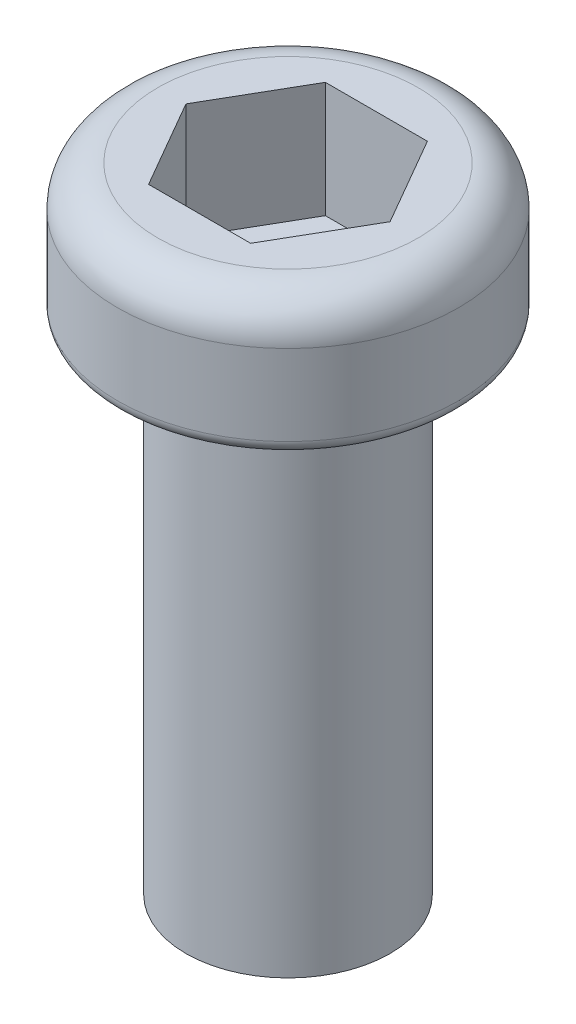
ISO-10303-21;
HEADER;
FILE_DESCRIPTION(('STEP AP214'),'2;1');
FILE_NAME('part.step','',(''),(''),'','','');
FILE_SCHEMA(('AUTOMOTIVE_DESIGN { 1 0 10303 214 1 1 1 1 }'));
ENDSEC;
DATA;
#1=APPLICATION_CONTEXT('core data for automotive mechanical design processes');
#2=APPLICATION_PROTOCOL_DEFINITION('international standard','automotive_design',2000,#1);
#3=PRODUCT_CONTEXT('',#1,'mechanical');
#4=PRODUCT('Part','Part','',(#3));
#5=PRODUCT_RELATED_PRODUCT_CATEGORY('part','',(#4));
#6=PRODUCT_DEFINITION_FORMATION('','',#4);
#7=PRODUCT_DEFINITION_CONTEXT('part definition',#1,'design');
#8=PRODUCT_DEFINITION('design','',#6,#7);
#9=PRODUCT_DEFINITION_SHAPE('','',#8);
#10=(LENGTH_UNIT() NAMED_UNIT(*) SI_UNIT(.MILLI.,.METRE.));
#11=(NAMED_UNIT(*) PLANE_ANGLE_UNIT() SI_UNIT($,.RADIAN.));
#12=(NAMED_UNIT(*) SI_UNIT($,.STERADIAN.) SOLID_ANGLE_UNIT());
#13=UNCERTAINTY_MEASURE_WITH_UNIT(LENGTH_MEASURE(1.E-05),#10,'distance_accuracy_value','');
#14=(GEOMETRIC_REPRESENTATION_CONTEXT(3) GLOBAL_UNCERTAINTY_ASSIGNED_CONTEXT((#13)) GLOBAL_UNIT_ASSIGNED_CONTEXT((#10,
#11,#12)) REPRESENTATION_CONTEXT('',''));
#15=CARTESIAN_POINT('',(0.,0.,0.));
#16=DIRECTION('',(0.,0.,1.));
#17=DIRECTION('',(1.,0.,0.));
#18=AXIS2_PLACEMENT_3D('',#15,#16,#17);
#19=CARTESIAN_POINT('',(0.,2.5,0.));
#20=DIRECTION('',(0.,-1.,0.));
#21=DIRECTION('',(0.,0.,-1.));
#22=AXIS2_PLACEMENT_3D('',#19,#20,#21);
#23=CYLINDRICAL_SURFACE('',#22,3.175);
#24=CARTESIAN_POINT('',(0.,0.25,0.));
#25=DIRECTION('',(0.,1.,0.));
#26=DIRECTION('',(0.,0.,1.));
#27=AXIS2_PLACEMENT_3D('',#24,#25,#26);
#28=CIRCLE('',#27,3.175);
#29=CARTESIAN_POINT('',(0.,0.25,3.175));
#30=VERTEX_POINT('',#29);
#31=EDGE_CURVE('E41',#30,#30,#28,.T.);
#32=ORIENTED_EDGE('',*,*,#31,.T.);
#33=EDGE_LOOP('',(#32));
#34=FACE_BOUND('',#33,.T.);
#35=CARTESIAN_POINT('',(0.,1.75,0.));
#36=DIRECTION('',(0.,1.,0.));
#37=DIRECTION('',(0.,0.,1.));
#38=AXIS2_PLACEMENT_3D('',#35,#36,#37);
#39=CIRCLE('',#38,3.175);
#40=CARTESIAN_POINT('',(0.,1.75,3.175));
#41=VERTEX_POINT('',#40);
#42=EDGE_CURVE('E144',#41,#41,#39,.F.);
#43=ORIENTED_EDGE('',*,*,#42,.T.);
#44=EDGE_LOOP('',(#43));
#45=FACE_BOUND('',#44,.T.);
#46=ADVANCED_FACE('F33',(#34,#45),#23,.T.);
#47=CARTESIAN_POINT('',(0.,2.5,0.));
#48=DIRECTION('',(0.,1.,0.));
#49=DIRECTION('',(0.,0.,1.));
#50=AXIS2_PLACEMENT_3D('',#47,#48,#49);
#51=PLANE('',#50);
#52=CARTESIAN_POINT('',(0.,2.5,0.));
#53=DIRECTION('',(0.,1.,0.));
#54=DIRECTION('',(0.,0.,1.));
#55=AXIS2_PLACEMENT_3D('',#52,#53,#54);
#56=CIRCLE('',#55,2.425);
#57=CARTESIAN_POINT('',(0.,2.5,2.425));
#58=VERTEX_POINT('',#57);
#59=EDGE_CURVE('E136',#58,#58,#56,.T.);
#60=ORIENTED_EDGE('',*,*,#59,.T.);
#61=EDGE_LOOP('',(#60));
#62=FACE_BOUND('',#61,.T.);
#63=DIRECTION('',(-0.5,0.,-0.866025403784438));
#64=VECTOR('',#63,1.);
#65=CARTESIAN_POINT('',(1.9,2.5,0.));
#66=LINE('',#65,#64);
#67=CARTESIAN_POINT('',(1.9,2.5,0.));
#68=VERTEX_POINT('',#67);
#69=CARTESIAN_POINT('',(0.95,2.5,-1.64544826719043));
#70=VERTEX_POINT('',#69);
#71=EDGE_CURVE('E48',#68,#70,#66,.T.);
#72=ORIENTED_EDGE('',*,*,#71,.F.);
#73=DIRECTION('',(0.5,0.,-0.866025403784439));
#74=VECTOR('',#73,1.);
#75=CARTESIAN_POINT('',(0.95,2.5,1.64544826719043));
#76=LINE('',#75,#74);
#77=CARTESIAN_POINT('',(0.95,2.5,1.64544826719043));
#78=VERTEX_POINT('',#77);
#79=EDGE_CURVE('E132',#78,#68,#76,.T.);
#80=ORIENTED_EDGE('',*,*,#79,.F.);
#81=DIRECTION('',(1.,0.,0.));
#82=VECTOR('',#81,1.);
#83=CARTESIAN_POINT('',(-0.95,2.5,1.64544826719043));
#84=LINE('',#83,#82);
#85=CARTESIAN_POINT('',(-0.95,2.5,1.64544826719043));
#86=VERTEX_POINT('',#85);
#87=EDGE_CURVE('E130',#86,#78,#84,.T.);
#88=ORIENTED_EDGE('',*,*,#87,.F.);
#89=DIRECTION('',(0.5,0.,0.866025403784438));
#90=VECTOR('',#89,1.);
#91=CARTESIAN_POINT('',(-1.9,2.5,0.));
#92=LINE('',#91,#90);
#93=CARTESIAN_POINT('',(-1.9,2.5,0.));
#94=VERTEX_POINT('',#93);
#95=EDGE_CURVE('E96',#94,#86,#92,.T.);
#96=ORIENTED_EDGE('',*,*,#95,.F.);
#97=DIRECTION('',(-0.5,0.,0.866025403784439));
#98=VECTOR('',#97,1.);
#99=CARTESIAN_POINT('',(-0.95,2.5,-1.64544826719043));
#100=LINE('',#99,#98);
#101=CARTESIAN_POINT('',(-0.95,2.5,-1.64544826719043));
#102=VERTEX_POINT('',#101);
#103=EDGE_CURVE('E126',#102,#94,#100,.T.);
#104=ORIENTED_EDGE('',*,*,#103,.F.);
#105=DIRECTION('',(-1.,0.,0.));
#106=VECTOR('',#105,1.);
#107=CARTESIAN_POINT('',(0.95,2.5,-1.64544826719043));
#108=LINE('',#107,#106);
#109=EDGE_CURVE('E122',#70,#102,#108,.T.);
#110=ORIENTED_EDGE('',*,*,#109,.F.);
#111=EDGE_LOOP('',(#72,#80,#88,#96,#104,#110));
#112=FACE_BOUND('',#111,.T.);
#113=ADVANCED_FACE('F161',(#62,#112),#51,.T.);
#114=CARTESIAN_POINT('',(0.,0.,0.));
#115=DIRECTION('',(0.,1.,0.));
#116=DIRECTION('',(0.,0.,1.));
#117=AXIS2_PLACEMENT_3D('',#114,#115,#116);
#118=PLANE('',#117);
#119=CARTESIAN_POINT('',(0.,0.,0.));
#120=DIRECTION('',(0.,1.,0.));
#121=DIRECTION('',(0.,0.,1.));
#122=AXIS2_PLACEMENT_3D('',#119,#120,#121);
#123=CIRCLE('',#122,2.925);
#124=CARTESIAN_POINT('',(0.,0.,2.925));
#125=VERTEX_POINT('',#124);
#126=EDGE_CURVE('E11',#125,#125,#123,.F.);
#127=ORIENTED_EDGE('',*,*,#126,.T.);
#128=EDGE_LOOP('',(#127));
#129=FACE_BOUND('',#128,.T.);
#130=CARTESIAN_POINT('',(0.,0.,0.));
#131=DIRECTION('',(0.,1.,0.));
#132=DIRECTION('',(0.,0.,1.));
#133=AXIS2_PLACEMENT_3D('',#130,#131,#132);
#134=CIRCLE('',#133,1.9);
#135=CARTESIAN_POINT('',(0.,0.,1.9));
#136=VERTEX_POINT('',#135);
#137=EDGE_CURVE('E203',#136,#136,#134,.T.);
#138=ORIENTED_EDGE('',*,*,#137,.T.);
#139=EDGE_LOOP('',(#138));
#140=FACE_BOUND('',#139,.T.);
#141=ADVANCED_FACE('F166',(#129,#140),#118,.F.);
#142=CARTESIAN_POINT('',(1.9,0.35,0.));
#143=DIRECTION('',(0.866025403784439,0.,-0.5));
#144=DIRECTION('',(-0.5,0.,-0.866025403784439));
#145=AXIS2_PLACEMENT_3D('',#142,#143,#144);
#146=PLANE('',#145);
#147=ORIENTED_EDGE('',*,*,#71,.T.);
#148=DIRECTION('',(0.,1.,0.));
#149=VECTOR('',#148,1.);
#150=CARTESIAN_POINT('',(0.95,0.35,-1.64544826719043));
#151=LINE('',#150,#149);
#152=CARTESIAN_POINT('',(0.95,0.35,-1.64544826719043));
#153=VERTEX_POINT('',#152);
#154=EDGE_CURVE('E78',#153,#70,#151,.T.);
#155=ORIENTED_EDGE('',*,*,#154,.F.);
#156=DIRECTION('',(-0.5,0.,-0.866025403784438));
#157=VECTOR('',#156,1.);
#158=CARTESIAN_POINT('',(1.9,0.35,0.));
#159=LINE('',#158,#157);
#160=CARTESIAN_POINT('',(1.9,0.35,0.));
#161=VERTEX_POINT('',#160);
#162=EDGE_CURVE('E134',#161,#153,#159,.T.);
#163=ORIENTED_EDGE('',*,*,#162,.F.);
#164=DIRECTION('',(0.,1.,0.));
#165=VECTOR('',#164,1.);
#166=CARTESIAN_POINT('',(1.9,0.35,0.));
#167=LINE('',#166,#165);
#168=EDGE_CURVE('E56',#161,#68,#167,.T.);
#169=ORIENTED_EDGE('',*,*,#168,.T.);
#170=EDGE_LOOP('',(#147,#155,#163,#169));
#171=FACE_BOUND('',#170,.T.);
#172=ADVANCED_FACE('F171',(#171),#146,.F.);
#173=CARTESIAN_POINT('',(0.95,0.35,1.64544826719043));
#174=DIRECTION('',(0.866025403784439,0.,0.5));
#175=DIRECTION('',(0.5,0.,-0.866025403784439));
#176=AXIS2_PLACEMENT_3D('',#173,#174,#175);
#177=PLANE('',#176);
#178=ORIENTED_EDGE('',*,*,#79,.T.);
#179=ORIENTED_EDGE('',*,*,#168,.F.);
#180=DIRECTION('',(0.5,0.,-0.866025403784439));
#181=VECTOR('',#180,1.);
#182=CARTESIAN_POINT('',(0.95,0.35,1.64544826719043));
#183=LINE('',#182,#181);
#184=CARTESIAN_POINT('',(0.95,0.35,1.64544826719043));
#185=VERTEX_POINT('',#184);
#186=EDGE_CURVE('E108',#185,#161,#183,.T.);
#187=ORIENTED_EDGE('',*,*,#186,.F.);
#188=DIRECTION('',(0.,1.,0.));
#189=VECTOR('',#188,1.);
#190=CARTESIAN_POINT('',(0.95,0.35,1.64544826719043));
#191=LINE('',#190,#189);
#192=EDGE_CURVE('E100',#185,#78,#191,.T.);
#193=ORIENTED_EDGE('',*,*,#192,.T.);
#194=EDGE_LOOP('',(#178,#179,#187,#193));
#195=FACE_BOUND('',#194,.T.);
#196=ADVANCED_FACE('F176',(#195),#177,.F.);
#197=CARTESIAN_POINT('',(-0.95,0.35,1.64544826719043));
#198=DIRECTION('',(0.,0.,1.));
#199=DIRECTION('',(1.,0.,0.));
#200=AXIS2_PLACEMENT_3D('',#197,#198,#199);
#201=PLANE('',#200);
#202=ORIENTED_EDGE('',*,*,#87,.T.);
#203=ORIENTED_EDGE('',*,*,#192,.F.);
#204=DIRECTION('',(1.,0.,0.));
#205=VECTOR('',#204,1.);
#206=CARTESIAN_POINT('',(-0.95,0.35,1.64544826719043));
#207=LINE('',#206,#205);
#208=CARTESIAN_POINT('',(-0.95,0.35,1.64544826719043));
#209=VERTEX_POINT('',#208);
#210=EDGE_CURVE('E104',#209,#185,#207,.T.);
#211=ORIENTED_EDGE('',*,*,#210,.F.);
#212=DIRECTION('',(0.,1.,0.));
#213=VECTOR('',#212,1.);
#214=CARTESIAN_POINT('',(-0.95,0.35,1.64544826719043));
#215=LINE('',#214,#213);
#216=EDGE_CURVE('E89',#209,#86,#215,.T.);
#217=ORIENTED_EDGE('',*,*,#216,.T.);
#218=EDGE_LOOP('',(#202,#203,#211,#217));
#219=FACE_BOUND('',#218,.T.);
#220=ADVANCED_FACE('F105',(#219),#201,.F.);
#221=CARTESIAN_POINT('',(-1.9,0.35,0.));
#222=DIRECTION('',(-0.866025403784439,0.,0.5));
#223=DIRECTION('',(0.5,0.,0.866025403784439));
#224=AXIS2_PLACEMENT_3D('',#221,#222,#223);
#225=PLANE('',#224);
#226=ORIENTED_EDGE('',*,*,#95,.T.);
#227=ORIENTED_EDGE('',*,*,#216,.F.);
#228=DIRECTION('',(0.5,0.,0.866025403784438));
#229=VECTOR('',#228,1.);
#230=CARTESIAN_POINT('',(-1.9,0.35,0.));
#231=LINE('',#230,#229);
#232=CARTESIAN_POINT('',(-1.9,0.35,0.));
#233=VERTEX_POINT('',#232);
#234=EDGE_CURVE('E93',#233,#209,#231,.T.);
#235=ORIENTED_EDGE('',*,*,#234,.F.);
#236=DIRECTION('',(0.,1.,0.));
#237=VECTOR('',#236,1.);
#238=CARTESIAN_POINT('',(-1.9,0.35,0.));
#239=LINE('',#238,#237);
#240=EDGE_CURVE('E101',#233,#94,#239,.T.);
#241=ORIENTED_EDGE('',*,*,#240,.T.);
#242=EDGE_LOOP('',(#226,#227,#235,#241));
#243=FACE_BOUND('',#242,.T.);
#244=ADVANCED_FACE('F91',(#243),#225,.F.);
#245=CARTESIAN_POINT('',(-0.95,0.35,-1.64544826719043));
#246=DIRECTION('',(-0.866025403784439,0.,-0.499999999999999));
#247=DIRECTION('',(-0.5,0.,0.866025403784439));
#248=AXIS2_PLACEMENT_3D('',#245,#246,#247);
#249=PLANE('',#248);
#250=ORIENTED_EDGE('',*,*,#103,.T.);
#251=ORIENTED_EDGE('',*,*,#240,.F.);
#252=DIRECTION('',(-0.5,0.,0.866025403784439));
#253=VECTOR('',#252,1.);
#254=CARTESIAN_POINT('',(-0.95,0.35,-1.64544826719043));
#255=LINE('',#254,#253);
#256=CARTESIAN_POINT('',(-0.95,0.35,-1.64544826719043));
#257=VERTEX_POINT('',#256);
#258=EDGE_CURVE('E114',#257,#233,#255,.T.);
#259=ORIENTED_EDGE('',*,*,#258,.F.);
#260=DIRECTION('',(0.,1.,0.));
#261=VECTOR('',#260,1.);
#262=CARTESIAN_POINT('',(-0.95,0.35,-1.64544826719043));
#263=LINE('',#262,#261);
#264=EDGE_CURVE('E139',#257,#102,#263,.T.);
#265=ORIENTED_EDGE('',*,*,#264,.T.);
#266=EDGE_LOOP('',(#250,#251,#259,#265));
#267=FACE_BOUND('',#266,.T.);
#268=ADVANCED_FACE('F180',(#267),#249,.F.);
#269=CARTESIAN_POINT('',(0.95,0.35,-1.64544826719043));
#270=DIRECTION('',(0.,0.,-1.));
#271=DIRECTION('',(-1.,0.,0.));
#272=AXIS2_PLACEMENT_3D('',#269,#270,#271);
#273=PLANE('',#272);
#274=ORIENTED_EDGE('',*,*,#109,.T.);
#275=ORIENTED_EDGE('',*,*,#264,.F.);
#276=DIRECTION('',(-1.,0.,0.));
#277=VECTOR('',#276,1.);
#278=CARTESIAN_POINT('',(0.95,0.35,-1.64544826719043));
#279=LINE('',#278,#277);
#280=EDGE_CURVE('E116',#153,#257,#279,.T.);
#281=ORIENTED_EDGE('',*,*,#280,.F.);
#282=ORIENTED_EDGE('',*,*,#154,.T.);
#283=EDGE_LOOP('',(#274,#275,#281,#282));
#284=FACE_BOUND('',#283,.T.);
#285=ADVANCED_FACE('F177',(#284),#273,.F.);
#286=CARTESIAN_POINT('',(0.,0.35,0.));
#287=DIRECTION('',(0.,1.,0.));
#288=DIRECTION('',(0.,0.,1.));
#289=AXIS2_PLACEMENT_3D('',#286,#287,#288);
#290=PLANE('',#289);
#291=ORIENTED_EDGE('',*,*,#162,.T.);
#292=ORIENTED_EDGE('',*,*,#280,.T.);
#293=ORIENTED_EDGE('',*,*,#258,.T.);
#294=ORIENTED_EDGE('',*,*,#234,.T.);
#295=ORIENTED_EDGE('',*,*,#210,.T.);
#296=ORIENTED_EDGE('',*,*,#186,.T.);
#297=EDGE_LOOP('',(#291,#292,#293,#294,#295,#296));
#298=FACE_BOUND('',#297,.T.);
#299=ADVANCED_FACE('F111',(#298),#290,.T.);
#300=CARTESIAN_POINT('',(0.,-9.3,0.));
#301=DIRECTION('',(0.,1.,0.));
#302=DIRECTION('',(0.,0.,1.));
#303=AXIS2_PLACEMENT_3D('',#300,#301,#302);
#304=CYLINDRICAL_SURFACE('',#303,1.9);
#305=CARTESIAN_POINT('',(0.,-9.3,0.));
#306=DIRECTION('',(0.,1.,0.));
#307=DIRECTION('',(0.,0.,1.));
#308=AXIS2_PLACEMENT_3D('',#305,#306,#307);
#309=CIRCLE('',#308,1.9);
#310=CARTESIAN_POINT('',(0.,-9.3,1.9));
#311=VERTEX_POINT('',#310);
#312=EDGE_CURVE('E123',#311,#311,#309,.T.);
#313=ORIENTED_EDGE('',*,*,#312,.T.);
#314=EDGE_LOOP('',(#313));
#315=FACE_BOUND('',#314,.T.);
#316=ORIENTED_EDGE('',*,*,#137,.F.);
#317=EDGE_LOOP('',(#316));
#318=FACE_BOUND('',#317,.T.);
#319=ADVANCED_FACE('F193',(#315,#318),#304,.T.);
#320=CARTESIAN_POINT('',(0.,-9.3,0.));
#321=DIRECTION('',(0.,1.,0.));
#322=DIRECTION('',(0.,0.,1.));
#323=AXIS2_PLACEMENT_3D('',#320,#321,#322);
#324=PLANE('',#323);
#325=ORIENTED_EDGE('',*,*,#312,.F.);
#326=EDGE_LOOP('',(#325));
#327=FACE_BOUND('',#326,.T.);
#328=ADVANCED_FACE('F157',(#327),#324,.F.);
#329=CARTESIAN_POINT('',(0.,1.75,0.));
#330=DIRECTION('',(0.,1.,0.));
#331=DIRECTION('',(0.,0.,1.));
#332=AXIS2_PLACEMENT_3D('',#329,#330,#331);
#333=TOROIDAL_SURFACE('',#332,2.425,0.75);
#334=ORIENTED_EDGE('',*,*,#42,.F.);
#335=EDGE_LOOP('',(#334));
#336=FACE_BOUND('',#335,.T.);
#337=ORIENTED_EDGE('',*,*,#59,.F.);
#338=EDGE_LOOP('',(#337));
#339=FACE_BOUND('',#338,.T.);
#340=ADVANCED_FACE('F152',(#336,#339),#333,.T.);
#341=CARTESIAN_POINT('',(0.,0.25,0.));
#342=DIRECTION('',(0.,1.,0.));
#343=DIRECTION('',(0.,0.,1.));
#344=AXIS2_PLACEMENT_3D('',#341,#342,#343);
#345=TOROIDAL_SURFACE('',#344,2.925,0.25);
#346=ORIENTED_EDGE('',*,*,#126,.F.);
#347=EDGE_LOOP('',(#346));
#348=FACE_BOUND('',#347,.T.);
#349=ORIENTED_EDGE('',*,*,#31,.F.);
#350=EDGE_LOOP('',(#349));
#351=FACE_BOUND('',#350,.T.);
#352=ADVANCED_FACE('F35',(#348,#351),#345,.T.);
#353=CLOSED_SHELL('',(#46,#113,#141,#172,#196,#220,#244,#268,#285,#299,#319,#328,#340,#352));
#354=MANIFOLD_SOLID_BREP('B2',#353);
#355=ADVANCED_BREP_SHAPE_REPRESENTATION('',(#18,#354),#14);
#356=SHAPE_DEFINITION_REPRESENTATION(#9,#355);
ENDSEC;
END-ISO-10303-21;
